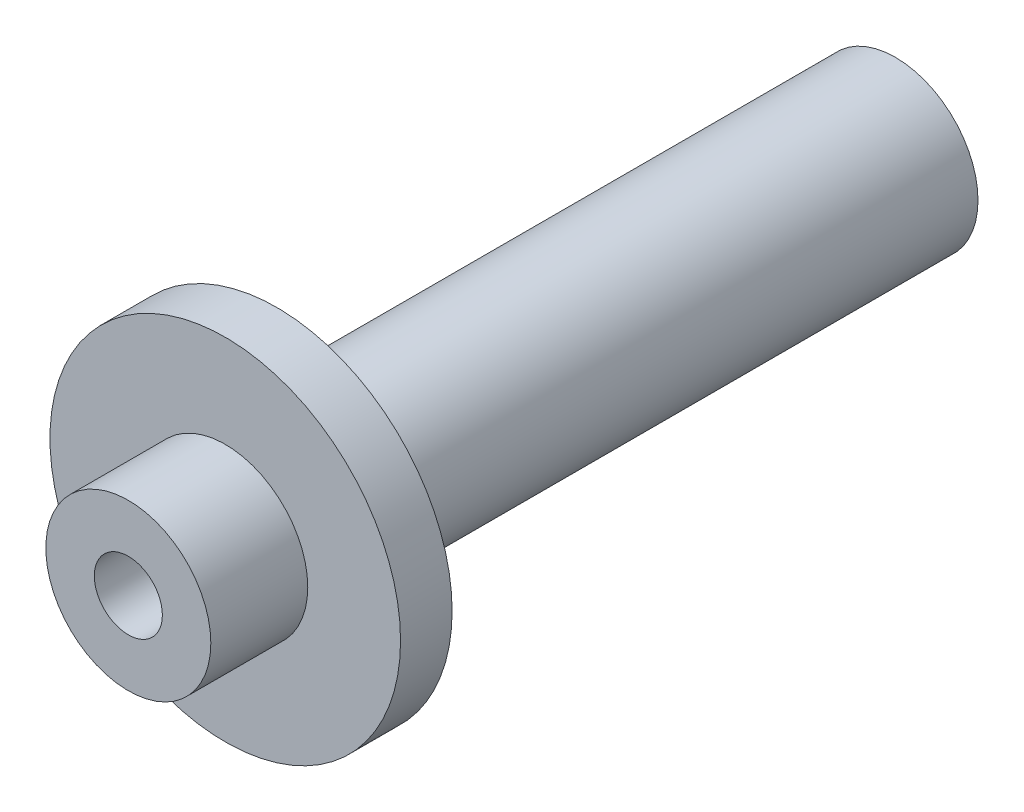
ISO-10303-21;
HEADER;
FILE_DESCRIPTION(('STEP AP214'),'2;1');
FILE_NAME('part.step','',(''),(''),'','','');
FILE_SCHEMA(('AUTOMOTIVE_DESIGN { 1 0 10303 214 1 1 1 1 }'));
ENDSEC;
DATA;
#1=APPLICATION_CONTEXT('core data for automotive mechanical design processes');
#2=APPLICATION_PROTOCOL_DEFINITION('international standard','automotive_design',2000,#1);
#3=PRODUCT_CONTEXT('',#1,'mechanical');
#4=PRODUCT('Part','Part','',(#3));
#5=PRODUCT_RELATED_PRODUCT_CATEGORY('part','',(#4));
#6=PRODUCT_DEFINITION_FORMATION('','',#4);
#7=PRODUCT_DEFINITION_CONTEXT('part definition',#1,'design');
#8=PRODUCT_DEFINITION('design','',#6,#7);
#9=PRODUCT_DEFINITION_SHAPE('','',#8);
#10=(LENGTH_UNIT() NAMED_UNIT(*) SI_UNIT(.MILLI.,.METRE.));
#11=(NAMED_UNIT(*) PLANE_ANGLE_UNIT() SI_UNIT($,.RADIAN.));
#12=(NAMED_UNIT(*) SI_UNIT($,.STERADIAN.) SOLID_ANGLE_UNIT());
#13=UNCERTAINTY_MEASURE_WITH_UNIT(LENGTH_MEASURE(1.E-05),#10,'distance_accuracy_value','');
#14=(GEOMETRIC_REPRESENTATION_CONTEXT(3) GLOBAL_UNCERTAINTY_ASSIGNED_CONTEXT((#13)) GLOBAL_UNIT_ASSIGNED_CONTEXT((#10,
#11,#12)) REPRESENTATION_CONTEXT('',''));
#15=CARTESIAN_POINT('',(0.,0.,0.));
#16=DIRECTION('',(0.,0.,1.));
#17=DIRECTION('',(1.,0.,0.));
#18=AXIS2_PLACEMENT_3D('',#15,#16,#17);
#19=CARTESIAN_POINT('',(0.,0.,2.5));
#20=DIRECTION('',(0.,0.,-1.));
#21=DIRECTION('',(-1.,0.,0.));
#22=AXIS2_PLACEMENT_3D('',#19,#20,#21);
#23=CYLINDRICAL_SURFACE('',#22,8.5);
#24=CARTESIAN_POINT('',(0.,0.,2.5));
#25=DIRECTION('',(0.,0.,1.));
#26=DIRECTION('',(1.,0.,0.));
#27=AXIS2_PLACEMENT_3D('',#24,#25,#26);
#28=CIRCLE('',#27,8.5);
#29=CARTESIAN_POINT('',(8.5,0.,2.5));
#30=VERTEX_POINT('',#29);
#31=EDGE_CURVE('E43',#30,#30,#28,.T.);
#32=ORIENTED_EDGE('',*,*,#31,.F.);
#33=EDGE_LOOP('',(#32));
#34=FACE_BOUND('',#33,.T.);
#35=CARTESIAN_POINT('',(0.,0.,0.));
#36=DIRECTION('',(0.,0.,1.));
#37=DIRECTION('',(1.,0.,0.));
#38=AXIS2_PLACEMENT_3D('',#35,#36,#37);
#39=CIRCLE('',#38,8.5);
#40=CARTESIAN_POINT('',(8.5,0.,0.));
#41=VERTEX_POINT('',#40);
#42=EDGE_CURVE('E48',#41,#41,#39,.T.);
#43=ORIENTED_EDGE('',*,*,#42,.T.);
#44=EDGE_LOOP('',(#43));
#45=FACE_BOUND('',#44,.T.);
#46=ADVANCED_FACE('F33',(#34,#45),#23,.T.);
#47=CARTESIAN_POINT('',(0.,0.,2.5));
#48=DIRECTION('',(0.,0.,1.));
#49=DIRECTION('',(1.,0.,0.));
#50=AXIS2_PLACEMENT_3D('',#47,#48,#49);
#51=PLANE('',#50);
#52=CARTESIAN_POINT('',(0.,0.,2.5));
#53=DIRECTION('',(0.,0.,1.));
#54=DIRECTION('',(1.,0.,0.));
#55=AXIS2_PLACEMENT_3D('',#52,#53,#54);
#56=CIRCLE('',#55,4.);
#57=CARTESIAN_POINT('',(4.,0.,2.5));
#58=VERTEX_POINT('',#57);
#59=EDGE_CURVE('E39',#58,#58,#56,.T.);
#60=ORIENTED_EDGE('',*,*,#59,.F.);
#61=EDGE_LOOP('',(#60));
#62=FACE_BOUND('',#61,.T.);
#63=ORIENTED_EDGE('',*,*,#31,.T.);
#64=EDGE_LOOP('',(#63));
#65=FACE_BOUND('',#64,.T.);
#66=ADVANCED_FACE('F86',(#62,#65),#51,.T.);
#67=CARTESIAN_POINT('',(0.,0.,0.));
#68=DIRECTION('',(0.,0.,1.));
#69=DIRECTION('',(1.,0.,0.));
#70=AXIS2_PLACEMENT_3D('',#67,#68,#69);
#71=PLANE('',#70);
#72=CARTESIAN_POINT('',(0.,0.,0.));
#73=DIRECTION('',(0.,0.,1.));
#74=DIRECTION('',(1.,0.,0.));
#75=AXIS2_PLACEMENT_3D('',#72,#73,#74);
#76=CIRCLE('',#75,4.);
#77=CARTESIAN_POINT('',(4.,0.,0.));
#78=VERTEX_POINT('',#77);
#79=EDGE_CURVE('E10',#78,#78,#76,.F.);
#80=ORIENTED_EDGE('',*,*,#79,.F.);
#81=EDGE_LOOP('',(#80));
#82=FACE_BOUND('',#81,.T.);
#83=ORIENTED_EDGE('',*,*,#42,.F.);
#84=EDGE_LOOP('',(#83));
#85=FACE_BOUND('',#84,.T.);
#86=ADVANCED_FACE('F91',(#82,#85),#71,.F.);
#87=CARTESIAN_POINT('',(0.,0.,7.2));
#88=DIRECTION('',(0.,0.,-1.));
#89=DIRECTION('',(-1.,0.,0.));
#90=AXIS2_PLACEMENT_3D('',#87,#88,#89);
#91=CYLINDRICAL_SURFACE('',#90,4.);
#92=CARTESIAN_POINT('',(0.,0.,7.2));
#93=DIRECTION('',(0.,0.,1.));
#94=DIRECTION('',(1.,0.,0.));
#95=AXIS2_PLACEMENT_3D('',#92,#93,#94);
#96=CIRCLE('',#95,4.);
#97=CARTESIAN_POINT('',(4.,0.,7.2));
#98=VERTEX_POINT('',#97);
#99=EDGE_CURVE('E51',#98,#98,#96,.T.);
#100=ORIENTED_EDGE('',*,*,#99,.F.);
#101=EDGE_LOOP('',(#100));
#102=FACE_BOUND('',#101,.T.);
#103=ORIENTED_EDGE('',*,*,#59,.T.);
#104=EDGE_LOOP('',(#103));
#105=FACE_BOUND('',#104,.T.);
#106=ADVANCED_FACE('F99',(#102,#105),#91,.T.);
#107=CARTESIAN_POINT('',(0.,0.,7.2));
#108=DIRECTION('',(0.,0.,1.));
#109=DIRECTION('',(1.,0.,0.));
#110=AXIS2_PLACEMENT_3D('',#107,#108,#109);
#111=PLANE('',#110);
#112=CARTESIAN_POINT('',(0.,0.,7.2));
#113=DIRECTION('',(0.,0.,1.));
#114=DIRECTION('',(1.,0.,0.));
#115=AXIS2_PLACEMENT_3D('',#112,#113,#114);
#116=CIRCLE('',#115,1.65);
#117=CARTESIAN_POINT('',(1.65,0.,7.2));
#118=VERTEX_POINT('',#117);
#119=EDGE_CURVE('E61',#118,#118,#116,.T.);
#120=ORIENTED_EDGE('',*,*,#119,.F.);
#121=EDGE_LOOP('',(#120));
#122=FACE_BOUND('',#121,.T.);
#123=ORIENTED_EDGE('',*,*,#99,.T.);
#124=EDGE_LOOP('',(#123));
#125=FACE_BOUND('',#124,.T.);
#126=ADVANCED_FACE('F104',(#122,#125),#111,.T.);
#127=CARTESIAN_POINT('',(0.,0.,-4.8));
#128=DIRECTION('',(0.,0.,1.));
#129=DIRECTION('',(1.,0.,0.));
#130=AXIS2_PLACEMENT_3D('',#127,#128,#129);
#131=CYLINDRICAL_SURFACE('',#130,1.65);
#132=ORIENTED_EDGE('',*,*,#119,.T.);
#133=EDGE_LOOP('',(#132));
#134=FACE_BOUND('',#133,.T.);
#135=CARTESIAN_POINT('',(0.,0.,0.));
#136=DIRECTION('',(0.,0.,1.));
#137=DIRECTION('',(1.,0.,0.));
#138=AXIS2_PLACEMENT_3D('',#135,#136,#137);
#139=CIRCLE('',#138,1.65);
#140=CARTESIAN_POINT('',(1.65,0.,0.));
#141=VERTEX_POINT('',#140);
#142=EDGE_CURVE('E57',#141,#141,#139,.T.);
#143=ORIENTED_EDGE('',*,*,#142,.F.);
#144=EDGE_LOOP('',(#143));
#145=FACE_BOUND('',#144,.T.);
#146=ADVANCED_FACE('F82',(#134,#145),#131,.F.);
#147=CARTESIAN_POINT('',(0.,0.,0.));
#148=DIRECTION('',(0.,0.,-1.));
#149=DIRECTION('',(-1.,0.,0.));
#150=AXIS2_PLACEMENT_3D('',#147,#148,#149);
#151=PLANE('',#150);
#152=ORIENTED_EDGE('',*,*,#142,.T.);
#153=EDGE_LOOP('',(#152));
#154=FACE_BOUND('',#153,.T.);
#155=ADVANCED_FACE('F75',(#154),#151,.F.);
#156=CARTESIAN_POINT('',(0.,0.,-30.));
#157=DIRECTION('',(0.,0.,1.));
#158=DIRECTION('',(1.,0.,0.));
#159=AXIS2_PLACEMENT_3D('',#156,#157,#158);
#160=CYLINDRICAL_SURFACE('',#159,4.);
#161=CARTESIAN_POINT('',(0.,0.,-30.));
#162=DIRECTION('',(0.,0.,-1.));
#163=DIRECTION('',(-1.,0.,0.));
#164=AXIS2_PLACEMENT_3D('',#161,#162,#163);
#165=CIRCLE('',#164,4.);
#166=CARTESIAN_POINT('',(-4.,0.,-30.));
#167=VERTEX_POINT('',#166);
#168=EDGE_CURVE('E65',#167,#167,#165,.T.);
#169=ORIENTED_EDGE('',*,*,#168,.F.);
#170=EDGE_LOOP('',(#169));
#171=FACE_BOUND('',#170,.T.);
#172=ORIENTED_EDGE('',*,*,#79,.T.);
#173=EDGE_LOOP('',(#172));
#174=FACE_BOUND('',#173,.T.);
#175=ADVANCED_FACE('F73',(#171,#174),#160,.T.);
#176=CARTESIAN_POINT('',(0.,0.,-30.));
#177=DIRECTION('',(0.,0.,-1.));
#178=DIRECTION('',(-1.,0.,0.));
#179=AXIS2_PLACEMENT_3D('',#176,#177,#178);
#180=PLANE('',#179);
#181=ORIENTED_EDGE('',*,*,#168,.T.);
#182=EDGE_LOOP('',(#181));
#183=FACE_BOUND('',#182,.T.);
#184=ADVANCED_FACE('F71',(#183),#180,.T.);
#185=CLOSED_SHELL('',(#46,#66,#86,#106,#126,#146,#155,#175,#184));
#186=MANIFOLD_SOLID_BREP('B2',#185);
#187=ADVANCED_BREP_SHAPE_REPRESENTATION('',(#18,#186),#14);
#188=SHAPE_DEFINITION_REPRESENTATION(#9,#187);
ENDSEC;
END-ISO-10303-21;
